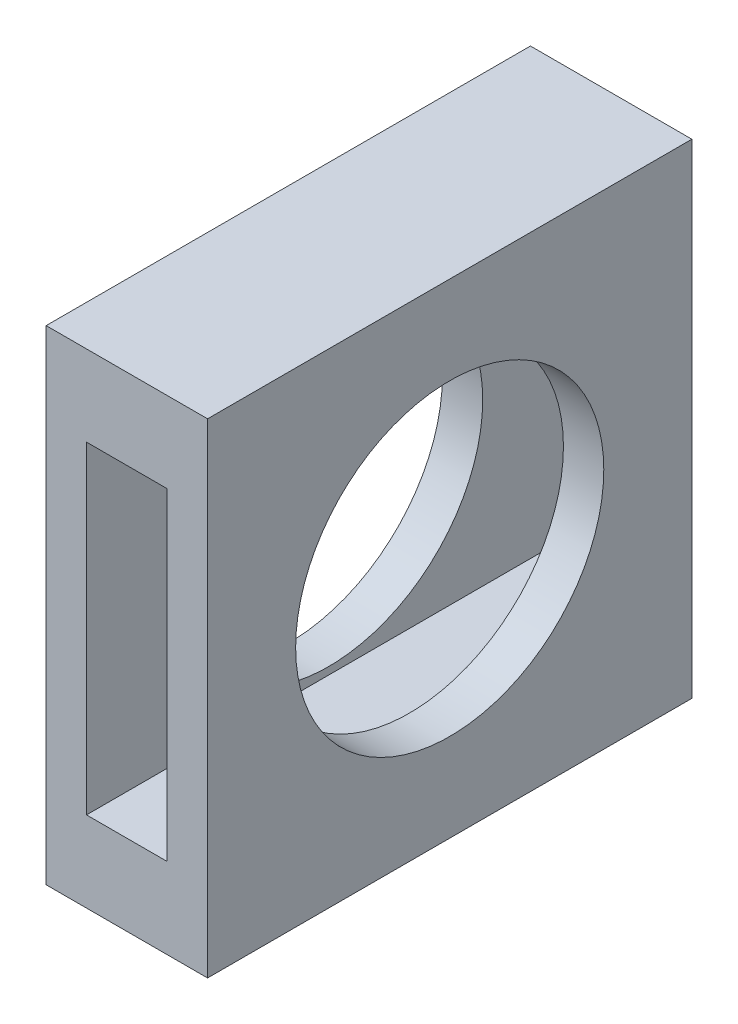
ISO-10303-21;
HEADER;
FILE_DESCRIPTION(('STEP AP214'),'2;1');
FILE_NAME('part.step','',(''),(''),'','','');
FILE_SCHEMA(('AUTOMOTIVE_DESIGN { 1 0 10303 214 1 1 1 1 }'));
ENDSEC;
DATA;
#1=APPLICATION_CONTEXT('core data for automotive mechanical design processes');
#2=APPLICATION_PROTOCOL_DEFINITION('international standard','automotive_design',2000,#1);
#3=PRODUCT_CONTEXT('',#1,'mechanical');
#4=PRODUCT('Part','Part','',(#3));
#5=PRODUCT_RELATED_PRODUCT_CATEGORY('part','',(#4));
#6=PRODUCT_DEFINITION_FORMATION('','',#4);
#7=PRODUCT_DEFINITION_CONTEXT('part definition',#1,'design');
#8=PRODUCT_DEFINITION('design','',#6,#7);
#9=PRODUCT_DEFINITION_SHAPE('','',#8);
#10=(LENGTH_UNIT() NAMED_UNIT(*) SI_UNIT(.MILLI.,.METRE.));
#11=(NAMED_UNIT(*) PLANE_ANGLE_UNIT() SI_UNIT($,.RADIAN.));
#12=(NAMED_UNIT(*) SI_UNIT($,.STERADIAN.) SOLID_ANGLE_UNIT());
#13=UNCERTAINTY_MEASURE_WITH_UNIT(LENGTH_MEASURE(1.E-05),#10,'distance_accuracy_value','');
#14=(GEOMETRIC_REPRESENTATION_CONTEXT(3) GLOBAL_UNCERTAINTY_ASSIGNED_CONTEXT((#13)) GLOBAL_UNIT_ASSIGNED_CONTEXT((#10,
#11,#12)) REPRESENTATION_CONTEXT('',''));
#15=CARTESIAN_POINT('',(0.,0.,0.));
#16=DIRECTION('',(0.,0.,1.));
#17=DIRECTION('',(1.,0.,0.));
#18=AXIS2_PLACEMENT_3D('',#15,#16,#17);
#19=CARTESIAN_POINT('',(0.,0.,15.));
#20=DIRECTION('',(0.,0.,-1.));
#21=DIRECTION('',(-1.,0.,0.));
#22=AXIS2_PLACEMENT_3D('',#19,#20,#21);
#23=PLANE('',#22);
#24=DIRECTION('',(0.,1.,0.));
#25=VECTOR('',#24,1.);
#26=CARTESIAN_POINT('',(5.,-15.,15.));
#27=LINE('',#26,#25);
#28=CARTESIAN_POINT('',(5.,-15.,15.));
#29=VERTEX_POINT('',#28);
#30=CARTESIAN_POINT('',(5.,15.,15.));
#31=VERTEX_POINT('',#30);
#32=EDGE_CURVE('E140',#29,#31,#27,.T.);
#33=ORIENTED_EDGE('',*,*,#32,.T.);
#34=DIRECTION('',(-1.,0.,0.));
#35=VECTOR('',#34,1.);
#36=CARTESIAN_POINT('',(-5.,15.,15.));
#37=LINE('',#36,#35);
#38=CARTESIAN_POINT('',(-5.,15.,15.));
#39=VERTEX_POINT('',#38);
#40=EDGE_CURVE('E143',#31,#39,#37,.T.);
#41=ORIENTED_EDGE('',*,*,#40,.T.);
#42=DIRECTION('',(0.,-1.,0.));
#43=VECTOR('',#42,1.);
#44=CARTESIAN_POINT('',(-5.,-15.,15.));
#45=LINE('',#44,#43);
#46=CARTESIAN_POINT('',(-5.,-15.,15.));
#47=VERTEX_POINT('',#46);
#48=EDGE_CURVE('E146',#39,#47,#45,.T.);
#49=ORIENTED_EDGE('',*,*,#48,.T.);
#50=DIRECTION('',(1.,0.,0.));
#51=VECTOR('',#50,1.);
#52=CARTESIAN_POINT('',(-5.,-15.,15.));
#53=LINE('',#52,#51);
#54=EDGE_CURVE('E148',#47,#29,#53,.T.);
#55=ORIENTED_EDGE('',*,*,#54,.T.);
#56=EDGE_LOOP('',(#33,#41,#49,#55));
#57=FACE_BOUND('',#56,.T.);
#58=DIRECTION('',(0.,1.,0.));
#59=VECTOR('',#58,1.);
#60=CARTESIAN_POINT('',(2.5,-10.,15.));
#61=LINE('',#60,#59);
#62=CARTESIAN_POINT('',(2.5,-10.,15.));
#63=VERTEX_POINT('',#62);
#64=CARTESIAN_POINT('',(2.5,9.99999999999999,15.));
#65=VERTEX_POINT('',#64);
#66=EDGE_CURVE('E102',#63,#65,#61,.T.);
#67=ORIENTED_EDGE('',*,*,#66,.F.);
#68=DIRECTION('',(1.,0.,0.));
#69=VECTOR('',#68,1.);
#70=CARTESIAN_POINT('',(-2.5,-10.,15.));
#71=LINE('',#70,#69);
#72=CARTESIAN_POINT('',(-2.5,-10.,15.));
#73=VERTEX_POINT('',#72);
#74=EDGE_CURVE('E124',#73,#63,#71,.T.);
#75=ORIENTED_EDGE('',*,*,#74,.F.);
#76=DIRECTION('',(0.,-1.,0.));
#77=VECTOR('',#76,1.);
#78=CARTESIAN_POINT('',(-2.5,-10.,15.));
#79=LINE('',#78,#77);
#80=CARTESIAN_POINT('',(-2.5,9.99999999999999,15.));
#81=VERTEX_POINT('',#80);
#82=EDGE_CURVE('E122',#81,#73,#79,.T.);
#83=ORIENTED_EDGE('',*,*,#82,.F.);
#84=DIRECTION('',(-1.,0.,0.));
#85=VECTOR('',#84,1.);
#86=CARTESIAN_POINT('',(-2.5,9.99999999999999,15.));
#87=LINE('',#86,#85);
#88=EDGE_CURVE('E110',#65,#81,#87,.T.);
#89=ORIENTED_EDGE('',*,*,#88,.F.);
#90=EDGE_LOOP('',(#67,#75,#83,#89));
#91=FACE_BOUND('',#90,.T.);
#92=ADVANCED_FACE('F36',(#57,#91),#23,.F.);
#93=CARTESIAN_POINT('',(0.,0.,-15.));
#94=DIRECTION('',(0.,0.,-1.));
#95=DIRECTION('',(-1.,0.,0.));
#96=AXIS2_PLACEMENT_3D('',#93,#94,#95);
#97=PLANE('',#96);
#98=DIRECTION('',(0.,1.,0.));
#99=VECTOR('',#98,1.);
#100=CARTESIAN_POINT('',(5.,-15.,-15.));
#101=LINE('',#100,#99);
#102=CARTESIAN_POINT('',(5.,-15.,-15.));
#103=VERTEX_POINT('',#102);
#104=CARTESIAN_POINT('',(5.,15.,-15.));
#105=VERTEX_POINT('',#104);
#106=EDGE_CURVE('E118',#103,#105,#101,.T.);
#107=ORIENTED_EDGE('',*,*,#106,.F.);
#108=DIRECTION('',(1.,0.,0.));
#109=VECTOR('',#108,1.);
#110=CARTESIAN_POINT('',(-5.,-15.,-15.));
#111=LINE('',#110,#109);
#112=CARTESIAN_POINT('',(-5.,-15.,-15.));
#113=VERTEX_POINT('',#112);
#114=EDGE_CURVE('E144',#113,#103,#111,.T.);
#115=ORIENTED_EDGE('',*,*,#114,.F.);
#116=DIRECTION('',(0.,-1.,0.));
#117=VECTOR('',#116,1.);
#118=CARTESIAN_POINT('',(-5.,-15.,-15.));
#119=LINE('',#118,#117);
#120=CARTESIAN_POINT('',(-5.,15.,-15.));
#121=VERTEX_POINT('',#120);
#122=EDGE_CURVE('E155',#121,#113,#119,.T.);
#123=ORIENTED_EDGE('',*,*,#122,.F.);
#124=DIRECTION('',(-1.,0.,0.));
#125=VECTOR('',#124,1.);
#126=CARTESIAN_POINT('',(-5.,15.,-15.));
#127=LINE('',#126,#125);
#128=EDGE_CURVE('E153',#105,#121,#127,.T.);
#129=ORIENTED_EDGE('',*,*,#128,.F.);
#130=EDGE_LOOP('',(#107,#115,#123,#129));
#131=FACE_BOUND('',#130,.T.);
#132=DIRECTION('',(1.,0.,0.));
#133=VECTOR('',#132,1.);
#134=CARTESIAN_POINT('',(-2.5,-10.,-15.));
#135=LINE('',#134,#133);
#136=CARTESIAN_POINT('',(-2.5,-10.,-15.));
#137=VERTEX_POINT('',#136);
#138=CARTESIAN_POINT('',(2.5,-10.,-15.));
#139=VERTEX_POINT('',#138);
#140=EDGE_CURVE('E111',#137,#139,#135,.T.);
#141=ORIENTED_EDGE('',*,*,#140,.T.);
#142=DIRECTION('',(0.,1.,0.));
#143=VECTOR('',#142,1.);
#144=CARTESIAN_POINT('',(2.5,-10.,-15.));
#145=LINE('',#144,#143);
#146=CARTESIAN_POINT('',(2.5,9.99999999999999,-15.));
#147=VERTEX_POINT('',#146);
#148=EDGE_CURVE('E60',#139,#147,#145,.T.);
#149=ORIENTED_EDGE('',*,*,#148,.T.);
#150=DIRECTION('',(-1.,0.,0.));
#151=VECTOR('',#150,1.);
#152=CARTESIAN_POINT('',(-2.5,9.99999999999999,-15.));
#153=LINE('',#152,#151);
#154=CARTESIAN_POINT('',(-2.5,9.99999999999999,-15.));
#155=VERTEX_POINT('',#154);
#156=EDGE_CURVE('E117',#147,#155,#153,.T.);
#157=ORIENTED_EDGE('',*,*,#156,.T.);
#158=DIRECTION('',(0.,-1.,0.));
#159=VECTOR('',#158,1.);
#160=CARTESIAN_POINT('',(-2.5,-10.,-15.));
#161=LINE('',#160,#159);
#162=EDGE_CURVE('E132',#155,#137,#161,.T.);
#163=ORIENTED_EDGE('',*,*,#162,.T.);
#164=EDGE_LOOP('',(#141,#149,#157,#163));
#165=FACE_BOUND('',#164,.T.);
#166=ADVANCED_FACE('F174',(#131,#165),#97,.T.);
#167=CARTESIAN_POINT('',(5.,-15.,15.));
#168=DIRECTION('',(-1.,0.,0.));
#169=DIRECTION('',(0.,0.,1.));
#170=AXIS2_PLACEMENT_3D('',#167,#168,#169);
#171=PLANE('',#170);
#172=CARTESIAN_POINT('',(5.,0.,0.));
#173=DIRECTION('',(1.,0.,0.));
#174=DIRECTION('',(0.,0.,-1.));
#175=AXIS2_PLACEMENT_3D('',#172,#173,#174);
#176=CIRCLE('',#175,9.54440084156246);
#177=CARTESIAN_POINT('',(5.,0.,-9.54440084156246));
#178=VERTEX_POINT('',#177);
#179=EDGE_CURVE('E218',#178,#178,#176,.T.);
#180=ORIENTED_EDGE('',*,*,#179,.F.);
#181=EDGE_LOOP('',(#180));
#182=FACE_BOUND('',#181,.T.);
#183=ORIENTED_EDGE('',*,*,#106,.T.);
#184=DIRECTION('',(0.,0.,-1.));
#185=VECTOR('',#184,1.);
#186=CARTESIAN_POINT('',(5.,15.,15.));
#187=LINE('',#186,#185);
#188=EDGE_CURVE('E11',#31,#105,#187,.T.);
#189=ORIENTED_EDGE('',*,*,#188,.F.);
#190=ORIENTED_EDGE('',*,*,#32,.F.);
#191=DIRECTION('',(0.,0.,-1.));
#192=VECTOR('',#191,1.);
#193=CARTESIAN_POINT('',(5.,-15.,15.));
#194=LINE('',#193,#192);
#195=EDGE_CURVE('E150',#29,#103,#194,.T.);
#196=ORIENTED_EDGE('',*,*,#195,.T.);
#197=EDGE_LOOP('',(#183,#189,#190,#196));
#198=FACE_BOUND('',#197,.T.);
#199=ADVANCED_FACE('F38',(#182,#198),#171,.F.);
#200=CARTESIAN_POINT('',(-5.,15.,15.));
#201=DIRECTION('',(0.,-1.,0.));
#202=DIRECTION('',(0.,0.,-1.));
#203=AXIS2_PLACEMENT_3D('',#200,#201,#202);
#204=PLANE('',#203);
#205=ORIENTED_EDGE('',*,*,#128,.T.);
#206=DIRECTION('',(0.,0.,-1.));
#207=VECTOR('',#206,1.);
#208=CARTESIAN_POINT('',(-5.,15.,15.));
#209=LINE('',#208,#207);
#210=EDGE_CURVE('E45',#39,#121,#209,.T.);
#211=ORIENTED_EDGE('',*,*,#210,.F.);
#212=ORIENTED_EDGE('',*,*,#40,.F.);
#213=ORIENTED_EDGE('',*,*,#188,.T.);
#214=EDGE_LOOP('',(#205,#211,#212,#213));
#215=FACE_BOUND('',#214,.T.);
#216=ADVANCED_FACE('F184',(#215),#204,.F.);
#217=CARTESIAN_POINT('',(-5.,-15.,15.));
#218=DIRECTION('',(1.,0.,0.));
#219=DIRECTION('',(0.,0.,-1.));
#220=AXIS2_PLACEMENT_3D('',#217,#218,#219);
#221=PLANE('',#220);
#222=CARTESIAN_POINT('',(-5.,0.,0.));
#223=DIRECTION('',(1.,0.,0.));
#224=DIRECTION('',(0.,0.,-1.));
#225=AXIS2_PLACEMENT_3D('',#222,#223,#224);
#226=CIRCLE('',#225,9.54440084156246);
#227=CARTESIAN_POINT('',(-5.,0.,-9.54440084156246));
#228=VERTEX_POINT('',#227);
#229=EDGE_CURVE('E130',#228,#228,#226,.T.);
#230=ORIENTED_EDGE('',*,*,#229,.T.);
#231=EDGE_LOOP('',(#230));
#232=FACE_BOUND('',#231,.T.);
#233=ORIENTED_EDGE('',*,*,#122,.T.);
#234=DIRECTION('',(0.,0.,-1.));
#235=VECTOR('',#234,1.);
#236=CARTESIAN_POINT('',(-5.,-15.,15.));
#237=LINE('',#236,#235);
#238=EDGE_CURVE('E160',#47,#113,#237,.T.);
#239=ORIENTED_EDGE('',*,*,#238,.F.);
#240=ORIENTED_EDGE('',*,*,#48,.F.);
#241=ORIENTED_EDGE('',*,*,#210,.T.);
#242=EDGE_LOOP('',(#233,#239,#240,#241));
#243=FACE_BOUND('',#242,.T.);
#244=ADVANCED_FACE('F168',(#232,#243),#221,.F.);
#245=CARTESIAN_POINT('',(-5.,-15.,15.));
#246=DIRECTION('',(0.,1.,0.));
#247=DIRECTION('',(0.,0.,1.));
#248=AXIS2_PLACEMENT_3D('',#245,#246,#247);
#249=PLANE('',#248);
#250=ORIENTED_EDGE('',*,*,#114,.T.);
#251=ORIENTED_EDGE('',*,*,#195,.F.);
#252=ORIENTED_EDGE('',*,*,#54,.F.);
#253=ORIENTED_EDGE('',*,*,#238,.T.);
#254=EDGE_LOOP('',(#250,#251,#252,#253));
#255=FACE_BOUND('',#254,.T.);
#256=ADVANCED_FACE('F178',(#255),#249,.F.);
#257=CARTESIAN_POINT('',(2.5,-10.,15.));
#258=DIRECTION('',(-1.,0.,0.));
#259=DIRECTION('',(0.,0.,1.));
#260=AXIS2_PLACEMENT_3D('',#257,#258,#259);
#261=PLANE('',#260);
#262=CARTESIAN_POINT('',(2.5,0.,0.));
#263=DIRECTION('',(-1.,0.,0.));
#264=DIRECTION('',(0.,0.,1.));
#265=AXIS2_PLACEMENT_3D('',#262,#263,#264);
#266=CIRCLE('',#265,9.54440084156246);
#267=CARTESIAN_POINT('',(2.5,0.,9.54440084156246));
#268=VERTEX_POINT('',#267);
#269=EDGE_CURVE('E213',#268,#268,#266,.T.);
#270=ORIENTED_EDGE('',*,*,#269,.F.);
#271=EDGE_LOOP('',(#270));
#272=FACE_BOUND('',#271,.T.);
#273=ORIENTED_EDGE('',*,*,#148,.F.);
#274=DIRECTION('',(0.,0.,-1.));
#275=VECTOR('',#274,1.);
#276=CARTESIAN_POINT('',(2.5,-10.,15.));
#277=LINE('',#276,#275);
#278=EDGE_CURVE('E106',#63,#139,#277,.T.);
#279=ORIENTED_EDGE('',*,*,#278,.F.);
#280=ORIENTED_EDGE('',*,*,#66,.T.);
#281=DIRECTION('',(0.,0.,-1.));
#282=VECTOR('',#281,1.);
#283=CARTESIAN_POINT('',(2.5,9.99999999999999,15.));
#284=LINE('',#283,#282);
#285=EDGE_CURVE('E105',#65,#147,#284,.T.);
#286=ORIENTED_EDGE('',*,*,#285,.T.);
#287=EDGE_LOOP('',(#273,#279,#280,#286));
#288=FACE_BOUND('',#287,.T.);
#289=ADVANCED_FACE('F104',(#272,#288),#261,.T.);
#290=CARTESIAN_POINT('',(-2.5,9.99999999999999,15.));
#291=DIRECTION('',(0.,-1.,0.));
#292=DIRECTION('',(0.,0.,-1.));
#293=AXIS2_PLACEMENT_3D('',#290,#291,#292);
#294=PLANE('',#293);
#295=ORIENTED_EDGE('',*,*,#156,.F.);
#296=ORIENTED_EDGE('',*,*,#285,.F.);
#297=ORIENTED_EDGE('',*,*,#88,.T.);
#298=DIRECTION('',(0.,0.,-1.));
#299=VECTOR('',#298,1.);
#300=CARTESIAN_POINT('',(-2.5,9.99999999999999,15.));
#301=LINE('',#300,#299);
#302=EDGE_CURVE('E119',#81,#155,#301,.T.);
#303=ORIENTED_EDGE('',*,*,#302,.T.);
#304=EDGE_LOOP('',(#295,#296,#297,#303));
#305=FACE_BOUND('',#304,.T.);
#306=ADVANCED_FACE('F114',(#305),#294,.T.);
#307=CARTESIAN_POINT('',(-2.5,-10.,15.));
#308=DIRECTION('',(1.,0.,0.));
#309=DIRECTION('',(0.,0.,-1.));
#310=AXIS2_PLACEMENT_3D('',#307,#308,#309);
#311=PLANE('',#310);
#312=CARTESIAN_POINT('',(-2.5,0.,0.));
#313=DIRECTION('',(1.,0.,0.));
#314=DIRECTION('',(0.,0.,-1.));
#315=AXIS2_PLACEMENT_3D('',#312,#313,#314);
#316=CIRCLE('',#315,9.54440084156246);
#317=CARTESIAN_POINT('',(-2.5,0.,-9.54440084156246));
#318=VERTEX_POINT('',#317);
#319=EDGE_CURVE('E40',#318,#318,#316,.T.);
#320=ORIENTED_EDGE('',*,*,#319,.F.);
#321=EDGE_LOOP('',(#320));
#322=FACE_BOUND('',#321,.T.);
#323=ORIENTED_EDGE('',*,*,#162,.F.);
#324=ORIENTED_EDGE('',*,*,#302,.F.);
#325=ORIENTED_EDGE('',*,*,#82,.T.);
#326=DIRECTION('',(0.,0.,-1.));
#327=VECTOR('',#326,1.);
#328=CARTESIAN_POINT('',(-2.5,-10.,15.));
#329=LINE('',#328,#327);
#330=EDGE_CURVE('E52',#73,#137,#329,.T.);
#331=ORIENTED_EDGE('',*,*,#330,.T.);
#332=EDGE_LOOP('',(#323,#324,#325,#331));
#333=FACE_BOUND('',#332,.T.);
#334=ADVANCED_FACE('F210',(#322,#333),#311,.T.);
#335=CARTESIAN_POINT('',(-2.5,-10.,15.));
#336=DIRECTION('',(0.,1.,0.));
#337=DIRECTION('',(0.,0.,1.));
#338=AXIS2_PLACEMENT_3D('',#335,#336,#337);
#339=PLANE('',#338);
#340=ORIENTED_EDGE('',*,*,#140,.F.);
#341=ORIENTED_EDGE('',*,*,#330,.F.);
#342=ORIENTED_EDGE('',*,*,#74,.T.);
#343=ORIENTED_EDGE('',*,*,#278,.T.);
#344=EDGE_LOOP('',(#340,#341,#342,#343));
#345=FACE_BOUND('',#344,.T.);
#346=ADVANCED_FACE('F230',(#345),#339,.T.);
#347=CARTESIAN_POINT('',(-25.,0.,0.));
#348=DIRECTION('',(1.,0.,0.));
#349=DIRECTION('',(0.,0.,-1.));
#350=AXIS2_PLACEMENT_3D('',#347,#348,#349);
#351=CYLINDRICAL_SURFACE('',#350,9.54440084156246);
#352=ORIENTED_EDGE('',*,*,#319,.T.);
#353=EDGE_LOOP('',(#352));
#354=FACE_BOUND('',#353,.T.);
#355=ORIENTED_EDGE('',*,*,#229,.F.);
#356=EDGE_LOOP('',(#355));
#357=FACE_BOUND('',#356,.T.);
#358=ADVANCED_FACE('F225',(#354,#357),#351,.F.);
#359=ORIENTED_EDGE('',*,*,#269,.T.);
#360=EDGE_LOOP('',(#359));
#361=FACE_BOUND('',#360,.T.);
#362=ORIENTED_EDGE('',*,*,#179,.T.);
#363=EDGE_LOOP('',(#362));
#364=FACE_BOUND('',#363,.T.);
#365=ADVANCED_FACE('F223',(#361,#364),#351,.F.);
#366=CLOSED_SHELL('',(#92,#166,#199,#216,#244,#256,#289,#306,#334,#346,#358,#365));
#367=MANIFOLD_SOLID_BREP('B2',#366);
#368=ADVANCED_BREP_SHAPE_REPRESENTATION('',(#18,#367),#14);
#369=SHAPE_DEFINITION_REPRESENTATION(#9,#368);
ENDSEC;
END-ISO-10303-21;
